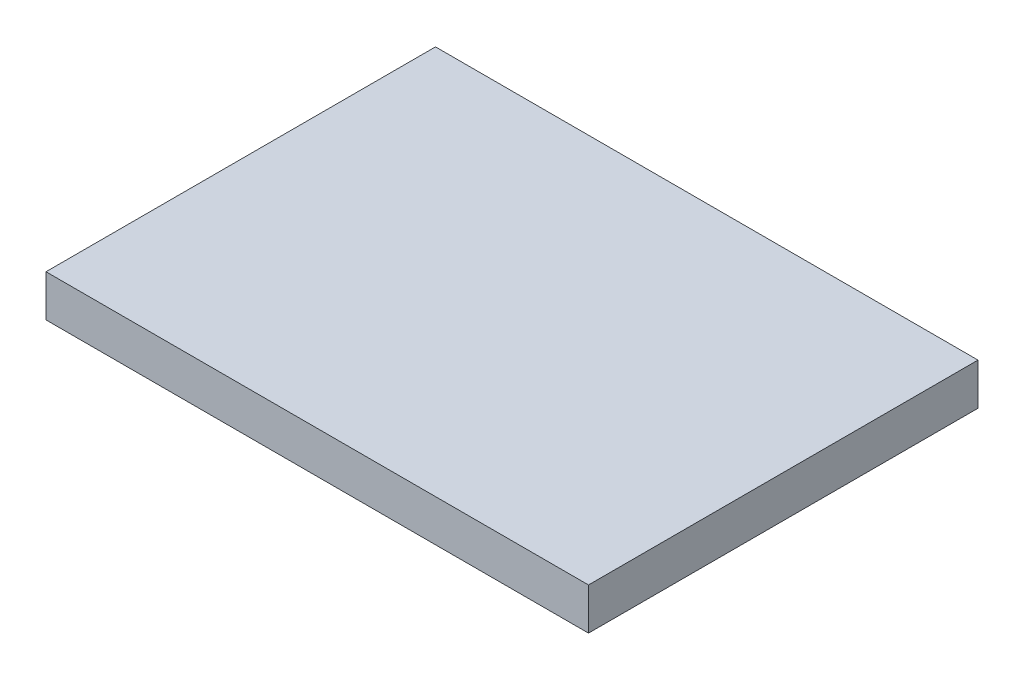
ISO-10303-21;
HEADER;
FILE_DESCRIPTION(('STEP AP214'),'2;1');
FILE_NAME('part.step','',(''),(''),'','','');
FILE_SCHEMA(('AUTOMOTIVE_DESIGN { 1 0 10303 214 1 1 1 1 }'));
ENDSEC;
DATA;
#1=APPLICATION_CONTEXT('core data for automotive mechanical design processes');
#2=APPLICATION_PROTOCOL_DEFINITION('international standard','automotive_design',2000,#1);
#3=PRODUCT_CONTEXT('',#1,'mechanical');
#4=PRODUCT('Part','Part','',(#3));
#5=PRODUCT_RELATED_PRODUCT_CATEGORY('part','',(#4));
#6=PRODUCT_DEFINITION_FORMATION('','',#4);
#7=PRODUCT_DEFINITION_CONTEXT('part definition',#1,'design');
#8=PRODUCT_DEFINITION('design','',#6,#7);
#9=PRODUCT_DEFINITION_SHAPE('','',#8);
#10=(LENGTH_UNIT() NAMED_UNIT(*) SI_UNIT(.MILLI.,.METRE.));
#11=(NAMED_UNIT(*) PLANE_ANGLE_UNIT() SI_UNIT($,.RADIAN.));
#12=(NAMED_UNIT(*) SI_UNIT($,.STERADIAN.) SOLID_ANGLE_UNIT());
#13=UNCERTAINTY_MEASURE_WITH_UNIT(LENGTH_MEASURE(1.E-05),#10,'distance_accuracy_value','');
#14=(GEOMETRIC_REPRESENTATION_CONTEXT(3) GLOBAL_UNCERTAINTY_ASSIGNED_CONTEXT((#13)) GLOBAL_UNIT_ASSIGNED_CONTEXT((#10,
#11,#12)) REPRESENTATION_CONTEXT('',''));
#15=CARTESIAN_POINT('',(0.,0.,0.));
#16=DIRECTION('',(0.,0.,1.));
#17=DIRECTION('',(1.,0.,0.));
#18=AXIS2_PLACEMENT_3D('',#15,#16,#17);
#19=CARTESIAN_POINT('',(247.65,38.1,177.8));
#20=DIRECTION('',(-1.,0.,0.));
#21=DIRECTION('',(0.,0.,1.));
#22=AXIS2_PLACEMENT_3D('',#19,#20,#21);
#23=PLANE('',#22);
#24=DIRECTION('',(0.,0.,-1.));
#25=VECTOR('',#24,1.);
#26=CARTESIAN_POINT('',(247.65,0.,177.8));
#27=LINE('',#26,#25);
#28=CARTESIAN_POINT('',(247.65,0.,177.8));
#29=VERTEX_POINT('',#28);
#30=CARTESIAN_POINT('',(247.65,0.,-177.8));
#31=VERTEX_POINT('',#30);
#32=EDGE_CURVE('E107',#29,#31,#27,.T.);
#33=ORIENTED_EDGE('',*,*,#32,.T.);
#34=DIRECTION('',(0.,-1.,0.));
#35=VECTOR('',#34,1.);
#36=CARTESIAN_POINT('',(247.65,38.1,-177.8));
#37=LINE('',#36,#35);
#38=CARTESIAN_POINT('',(247.65,38.1,-177.8));
#39=VERTEX_POINT('',#38);
#40=EDGE_CURVE('E11',#39,#31,#37,.T.);
#41=ORIENTED_EDGE('',*,*,#40,.F.);
#42=DIRECTION('',(0.,0.,-1.));
#43=VECTOR('',#42,1.);
#44=CARTESIAN_POINT('',(247.65,38.1,177.8));
#45=LINE('',#44,#43);
#46=CARTESIAN_POINT('',(247.65,38.1,177.8));
#47=VERTEX_POINT('',#46);
#48=EDGE_CURVE('E91',#47,#39,#45,.T.);
#49=ORIENTED_EDGE('',*,*,#48,.F.);
#50=DIRECTION('',(0.,-1.,0.));
#51=VECTOR('',#50,1.);
#52=CARTESIAN_POINT('',(247.65,38.1,177.8));
#53=LINE('',#52,#51);
#54=EDGE_CURVE('E103',#47,#29,#53,.T.);
#55=ORIENTED_EDGE('',*,*,#54,.T.);
#56=EDGE_LOOP('',(#33,#41,#49,#55));
#57=FACE_BOUND('',#56,.T.);
#58=ADVANCED_FACE('F39',(#57),#23,.F.);
#59=CARTESIAN_POINT('',(-247.65,38.1,-177.8));
#60=DIRECTION('',(0.,0.,1.));
#61=DIRECTION('',(1.,0.,0.));
#62=AXIS2_PLACEMENT_3D('',#59,#60,#61);
#63=PLANE('',#62);
#64=DIRECTION('',(-1.,0.,0.));
#65=VECTOR('',#64,1.);
#66=CARTESIAN_POINT('',(-247.65,0.,-177.8));
#67=LINE('',#66,#65);
#68=CARTESIAN_POINT('',(-247.65,0.,-177.8));
#69=VERTEX_POINT('',#68);
#70=EDGE_CURVE('E96',#31,#69,#67,.T.);
#71=ORIENTED_EDGE('',*,*,#70,.T.);
#72=DIRECTION('',(0.,-1.,0.));
#73=VECTOR('',#72,1.);
#74=CARTESIAN_POINT('',(-247.65,38.1,-177.8));
#75=LINE('',#74,#73);
#76=CARTESIAN_POINT('',(-247.65,38.1,-177.8));
#77=VERTEX_POINT('',#76);
#78=EDGE_CURVE('E48',#77,#69,#75,.T.);
#79=ORIENTED_EDGE('',*,*,#78,.F.);
#80=DIRECTION('',(-1.,0.,0.));
#81=VECTOR('',#80,1.);
#82=CARTESIAN_POINT('',(-247.65,38.1,-177.8));
#83=LINE('',#82,#81);
#84=EDGE_CURVE('E86',#39,#77,#83,.T.);
#85=ORIENTED_EDGE('',*,*,#84,.F.);
#86=ORIENTED_EDGE('',*,*,#40,.T.);
#87=EDGE_LOOP('',(#71,#79,#85,#86));
#88=FACE_BOUND('',#87,.T.);
#89=ADVANCED_FACE('F95',(#88),#63,.F.);
#90=CARTESIAN_POINT('',(-247.65,38.1,177.8));
#91=DIRECTION('',(1.,0.,0.));
#92=DIRECTION('',(0.,0.,-1.));
#93=AXIS2_PLACEMENT_3D('',#90,#91,#92);
#94=PLANE('',#93);
#95=DIRECTION('',(0.,0.,1.));
#96=VECTOR('',#95,1.);
#97=CARTESIAN_POINT('',(-247.65,0.,177.8));
#98=LINE('',#97,#96);
#99=CARTESIAN_POINT('',(-247.65,0.,177.8));
#100=VERTEX_POINT('',#99);
#101=EDGE_CURVE('E73',#69,#100,#98,.T.);
#102=ORIENTED_EDGE('',*,*,#101,.T.);
#103=DIRECTION('',(0.,-1.,0.));
#104=VECTOR('',#103,1.);
#105=CARTESIAN_POINT('',(-247.65,38.1,177.8));
#106=LINE('',#105,#104);
#107=CARTESIAN_POINT('',(-247.65,38.1,177.8));
#108=VERTEX_POINT('',#107);
#109=EDGE_CURVE('E98',#108,#100,#106,.T.);
#110=ORIENTED_EDGE('',*,*,#109,.F.);
#111=DIRECTION('',(0.,0.,1.));
#112=VECTOR('',#111,1.);
#113=CARTESIAN_POINT('',(-247.65,38.1,177.8));
#114=LINE('',#113,#112);
#115=EDGE_CURVE('E89',#77,#108,#114,.T.);
#116=ORIENTED_EDGE('',*,*,#115,.F.);
#117=ORIENTED_EDGE('',*,*,#78,.T.);
#118=EDGE_LOOP('',(#102,#110,#116,#117));
#119=FACE_BOUND('',#118,.T.);
#120=ADVANCED_FACE('F99',(#119),#94,.F.);
#121=CARTESIAN_POINT('',(-247.65,38.1,177.8));
#122=DIRECTION('',(0.,0.,-1.));
#123=DIRECTION('',(-1.,0.,0.));
#124=AXIS2_PLACEMENT_3D('',#121,#122,#123);
#125=PLANE('',#124);
#126=DIRECTION('',(1.,0.,0.));
#127=VECTOR('',#126,1.);
#128=CARTESIAN_POINT('',(-247.65,0.,177.8));
#129=LINE('',#128,#127);
#130=EDGE_CURVE('E79',#100,#29,#129,.T.);
#131=ORIENTED_EDGE('',*,*,#130,.T.);
#132=ORIENTED_EDGE('',*,*,#54,.F.);
#133=DIRECTION('',(1.,0.,0.));
#134=VECTOR('',#133,1.);
#135=CARTESIAN_POINT('',(-247.65,38.1,177.8));
#136=LINE('',#135,#134);
#137=EDGE_CURVE('E56',#108,#47,#136,.T.);
#138=ORIENTED_EDGE('',*,*,#137,.F.);
#139=ORIENTED_EDGE('',*,*,#109,.T.);
#140=EDGE_LOOP('',(#131,#132,#138,#139));
#141=FACE_BOUND('',#140,.T.);
#142=ADVANCED_FACE('F120',(#141),#125,.F.);
#143=CARTESIAN_POINT('',(0.,38.1,0.));
#144=DIRECTION('',(0.,-1.,0.));
#145=DIRECTION('',(0.,0.,-1.));
#146=AXIS2_PLACEMENT_3D('',#143,#144,#145);
#147=PLANE('',#146);
#148=ORIENTED_EDGE('',*,*,#48,.T.);
#149=ORIENTED_EDGE('',*,*,#84,.T.);
#150=ORIENTED_EDGE('',*,*,#115,.T.);
#151=ORIENTED_EDGE('',*,*,#137,.T.);
#152=EDGE_LOOP('',(#148,#149,#150,#151));
#153=FACE_BOUND('',#152,.T.);
#154=ADVANCED_FACE('F87',(#153),#147,.F.);
#155=CARTESIAN_POINT('',(0.,0.,0.));
#156=DIRECTION('',(0.,-1.,0.));
#157=DIRECTION('',(0.,0.,-1.));
#158=AXIS2_PLACEMENT_3D('',#155,#156,#157);
#159=PLANE('',#158);
#160=ORIENTED_EDGE('',*,*,#32,.F.);
#161=ORIENTED_EDGE('',*,*,#130,.F.);
#162=ORIENTED_EDGE('',*,*,#101,.F.);
#163=ORIENTED_EDGE('',*,*,#70,.F.);
#164=EDGE_LOOP('',(#160,#161,#162,#163));
#165=FACE_BOUND('',#164,.T.);
#166=ADVANCED_FACE('F123',(#165),#159,.T.);
#167=CLOSED_SHELL('',(#58,#89,#120,#142,#154,#166));
#168=MANIFOLD_SOLID_BREP('B2',#167);
#169=ADVANCED_BREP_SHAPE_REPRESENTATION('',(#18,#168),#14);
#170=SHAPE_DEFINITION_REPRESENTATION(#9,#169);
ENDSEC;
END-ISO-10303-21;
